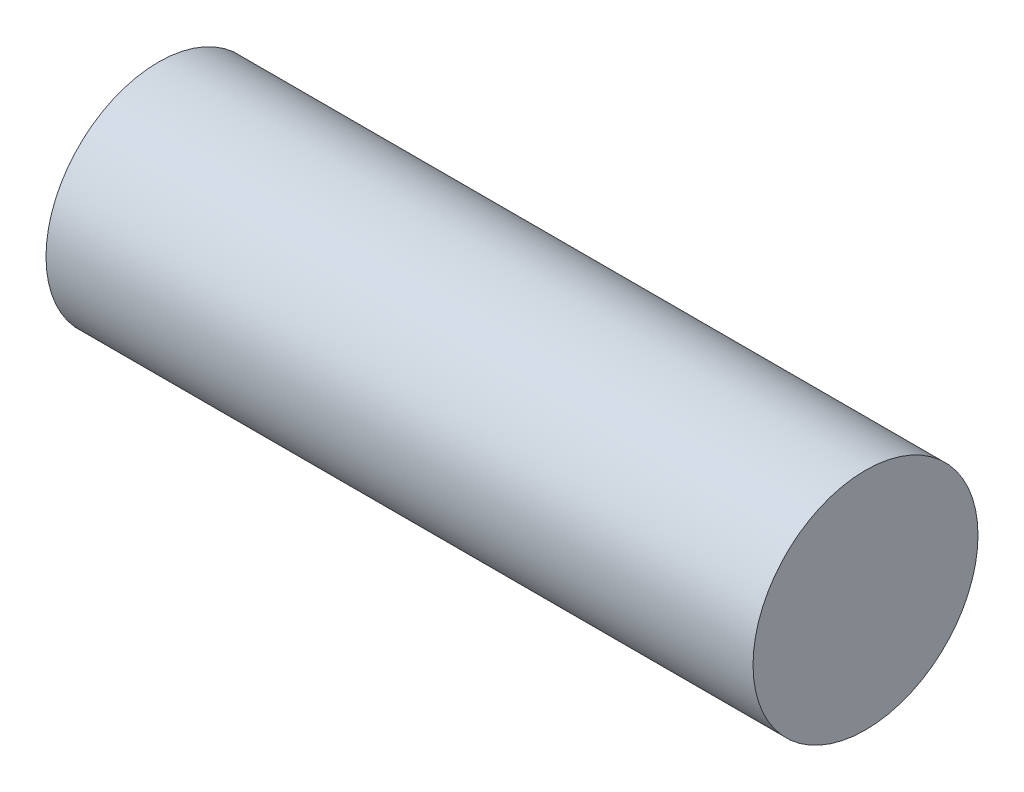
ISO-10303-21;
HEADER;
FILE_DESCRIPTION(('STEP AP214'),'2;1');
FILE_NAME('part.step','',(''),(''),'','','');
FILE_SCHEMA(('AUTOMOTIVE_DESIGN { 1 0 10303 214 1 1 1 1 }'));
ENDSEC;
DATA;
#1=APPLICATION_CONTEXT('core data for automotive mechanical design processes');
#2=APPLICATION_PROTOCOL_DEFINITION('international standard','automotive_design',2000,#1);
#3=PRODUCT_CONTEXT('',#1,'mechanical');
#4=PRODUCT('Part','Part','',(#3));
#5=PRODUCT_RELATED_PRODUCT_CATEGORY('part','',(#4));
#6=PRODUCT_DEFINITION_FORMATION('','',#4);
#7=PRODUCT_DEFINITION_CONTEXT('part definition',#1,'design');
#8=PRODUCT_DEFINITION('design','',#6,#7);
#9=PRODUCT_DEFINITION_SHAPE('','',#8);
#10=(LENGTH_UNIT() NAMED_UNIT(*) SI_UNIT(.MILLI.,.METRE.));
#11=(NAMED_UNIT(*) PLANE_ANGLE_UNIT() SI_UNIT($,.RADIAN.));
#12=(NAMED_UNIT(*) SI_UNIT($,.STERADIAN.) SOLID_ANGLE_UNIT());
#13=UNCERTAINTY_MEASURE_WITH_UNIT(LENGTH_MEASURE(1.E-05),#10,'distance_accuracy_value','');
#14=(GEOMETRIC_REPRESENTATION_CONTEXT(3) GLOBAL_UNCERTAINTY_ASSIGNED_CONTEXT((#13)) GLOBAL_UNIT_ASSIGNED_CONTEXT((#10,
#11,#12)) REPRESENTATION_CONTEXT('',''));
#15=CARTESIAN_POINT('',(0.,0.,0.));
#16=DIRECTION('',(0.,0.,1.));
#17=DIRECTION('',(1.,0.,0.));
#18=AXIS2_PLACEMENT_3D('',#15,#16,#17);
#19=CARTESIAN_POINT('',(5.5,0.,0.));
#20=DIRECTION('',(-1.,0.,0.));
#21=DIRECTION('',(0.,0.,1.));
#22=AXIS2_PLACEMENT_3D('',#19,#20,#21);
#23=CYLINDRICAL_SURFACE('',#22,1.75);
#24=CARTESIAN_POINT('',(5.5,0.,0.));
#25=DIRECTION('',(1.,0.,0.));
#26=DIRECTION('',(0.,0.,-1.));
#27=AXIS2_PLACEMENT_3D('',#24,#25,#26);
#28=CIRCLE('',#27,1.75);
#29=CARTESIAN_POINT('',(5.5,0.,-1.75));
#30=VERTEX_POINT('',#29);
#31=EDGE_CURVE('E10',#30,#30,#28,.T.);
#32=ORIENTED_EDGE('',*,*,#31,.F.);
#33=EDGE_LOOP('',(#32));
#34=FACE_BOUND('',#33,.T.);
#35=CARTESIAN_POINT('',(-5.5,0.,0.));
#36=DIRECTION('',(1.,0.,0.));
#37=DIRECTION('',(0.,0.,-1.));
#38=AXIS2_PLACEMENT_3D('',#35,#36,#37);
#39=CIRCLE('',#38,1.75);
#40=CARTESIAN_POINT('',(-5.5,0.,-1.75));
#41=VERTEX_POINT('',#40);
#42=EDGE_CURVE('E42',#41,#41,#39,.T.);
#43=ORIENTED_EDGE('',*,*,#42,.T.);
#44=EDGE_LOOP('',(#43));
#45=FACE_BOUND('',#44,.T.);
#46=ADVANCED_FACE('F39',(#34,#45),#23,.T.);
#47=CARTESIAN_POINT('',(5.5,0.,0.));
#48=DIRECTION('',(1.,0.,0.));
#49=DIRECTION('',(0.,0.,-1.));
#50=AXIS2_PLACEMENT_3D('',#47,#48,#49);
#51=PLANE('',#50);
#52=ORIENTED_EDGE('',*,*,#31,.T.);
#53=EDGE_LOOP('',(#52));
#54=FACE_BOUND('',#53,.T.);
#55=ADVANCED_FACE('F54',(#54),#51,.T.);
#56=CARTESIAN_POINT('',(-5.5,0.,0.));
#57=DIRECTION('',(1.,0.,0.));
#58=DIRECTION('',(0.,0.,-1.));
#59=AXIS2_PLACEMENT_3D('',#56,#57,#58);
#60=PLANE('',#59);
#61=ORIENTED_EDGE('',*,*,#42,.F.);
#62=EDGE_LOOP('',(#61));
#63=FACE_BOUND('',#62,.T.);
#64=ADVANCED_FACE('F52',(#63),#60,.F.);
#65=CLOSED_SHELL('',(#46,#55,#64));
#66=MANIFOLD_SOLID_BREP('B2',#65);
#67=ADVANCED_BREP_SHAPE_REPRESENTATION('',(#18,#66),#14);
#68=SHAPE_DEFINITION_REPRESENTATION(#9,#67);
ENDSEC;
END-ISO-10303-21;
